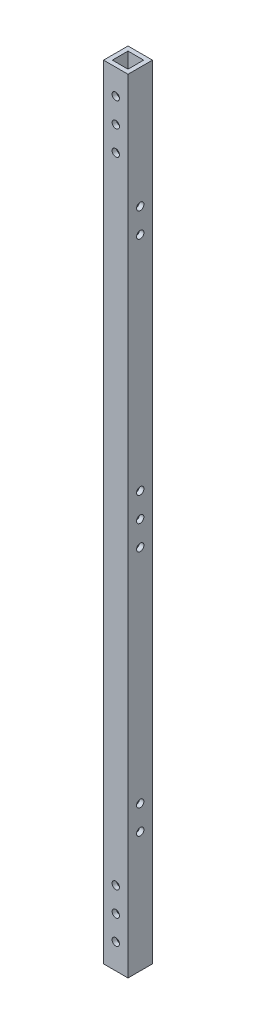
ISO-10303-21;
HEADER;
FILE_DESCRIPTION(('STEP AP214'),'2;1');
FILE_NAME('part.step','',(''),(''),'','','');
FILE_SCHEMA(('AUTOMOTIVE_DESIGN { 1 0 10303 214 1 1 1 1 }'));
ENDSEC;
DATA;
#1=APPLICATION_CONTEXT('core data for automotive mechanical design processes');
#2=APPLICATION_PROTOCOL_DEFINITION('international standard','automotive_design',2000,#1);
#3=PRODUCT_CONTEXT('',#1,'mechanical');
#4=PRODUCT('Part','Part','',(#3));
#5=PRODUCT_RELATED_PRODUCT_CATEGORY('part','',(#4));
#6=PRODUCT_DEFINITION_FORMATION('','',#4);
#7=PRODUCT_DEFINITION_CONTEXT('part definition',#1,'design');
#8=PRODUCT_DEFINITION('design','',#6,#7);
#9=PRODUCT_DEFINITION_SHAPE('','',#8);
#10=(LENGTH_UNIT() NAMED_UNIT(*) SI_UNIT(.MILLI.,.METRE.));
#11=(NAMED_UNIT(*) PLANE_ANGLE_UNIT() SI_UNIT($,.RADIAN.));
#12=(NAMED_UNIT(*) SI_UNIT($,.STERADIAN.) SOLID_ANGLE_UNIT());
#13=UNCERTAINTY_MEASURE_WITH_UNIT(LENGTH_MEASURE(1.E-05),#10,'distance_accuracy_value','');
#14=(GEOMETRIC_REPRESENTATION_CONTEXT(3) GLOBAL_UNCERTAINTY_ASSIGNED_CONTEXT((#13)) GLOBAL_UNIT_ASSIGNED_CONTEXT((#10,
#11,#12)) REPRESENTATION_CONTEXT('',''));
#15=CARTESIAN_POINT('',(0.,0.,0.));
#16=DIRECTION('',(0.,0.,1.));
#17=DIRECTION('',(1.,0.,0.));
#18=AXIS2_PLACEMENT_3D('',#15,#16,#17);
#19=CARTESIAN_POINT('',(0.,160.,0.));
#20=DIRECTION('',(0.,1.,0.));
#21=DIRECTION('',(0.,0.,1.));
#22=AXIS2_PLACEMENT_3D('',#19,#20,#21);
#23=PLANE('',#22);
#24=DIRECTION('',(0.,0.,-1.));
#25=VECTOR('',#24,1.);
#26=CARTESIAN_POINT('',(5.,160.,-5.));
#27=LINE('',#26,#25);
#28=CARTESIAN_POINT('',(5.,160.,5.));
#29=VERTEX_POINT('',#28);
#30=CARTESIAN_POINT('',(5.,160.,-5.));
#31=VERTEX_POINT('',#30);
#32=EDGE_CURVE('E156',#29,#31,#27,.T.);
#33=ORIENTED_EDGE('',*,*,#32,.T.);
#34=DIRECTION('',(-1.,0.,0.));
#35=VECTOR('',#34,1.);
#36=CARTESIAN_POINT('',(-5.,160.,-5.));
#37=LINE('',#36,#35);
#38=CARTESIAN_POINT('',(-5.,160.,-5.));
#39=VERTEX_POINT('',#38);
#40=EDGE_CURVE('E160',#31,#39,#37,.T.);
#41=ORIENTED_EDGE('',*,*,#40,.T.);
#42=DIRECTION('',(0.,0.,1.));
#43=VECTOR('',#42,1.);
#44=CARTESIAN_POINT('',(-5.,160.,-5.));
#45=LINE('',#44,#43);
#46=CARTESIAN_POINT('',(-5.,160.,5.));
#47=VERTEX_POINT('',#46);
#48=EDGE_CURVE('E164',#39,#47,#45,.T.);
#49=ORIENTED_EDGE('',*,*,#48,.T.);
#50=DIRECTION('',(1.,0.,0.));
#51=VECTOR('',#50,1.);
#52=CARTESIAN_POINT('',(-5.,160.,5.));
#53=LINE('',#52,#51);
#54=EDGE_CURVE('E167',#47,#29,#53,.T.);
#55=ORIENTED_EDGE('',*,*,#54,.T.);
#56=EDGE_LOOP('',(#33,#41,#49,#55));
#57=FACE_BOUND('',#56,.T.);
#58=DIRECTION('',(-1.,0.,0.));
#59=VECTOR('',#58,1.);
#60=CARTESIAN_POINT('',(-3.2,160.,-3.2));
#61=LINE('',#60,#59);
#62=CARTESIAN_POINT('',(3.2,160.,-3.2));
#63=VERTEX_POINT('',#62);
#64=CARTESIAN_POINT('',(-3.2,160.,-3.2));
#65=VERTEX_POINT('',#64);
#66=EDGE_CURVE('E115',#63,#65,#61,.T.);
#67=ORIENTED_EDGE('',*,*,#66,.F.);
#68=DIRECTION('',(0.,0.,-1.));
#69=VECTOR('',#68,1.);
#70=CARTESIAN_POINT('',(3.2,160.,-3.2));
#71=LINE('',#70,#69);
#72=CARTESIAN_POINT('',(3.2,160.,3.2));
#73=VERTEX_POINT('',#72);
#74=EDGE_CURVE('E106',#73,#63,#71,.T.);
#75=ORIENTED_EDGE('',*,*,#74,.F.);
#76=DIRECTION('',(1.,0.,0.));
#77=VECTOR('',#76,1.);
#78=CARTESIAN_POINT('',(-3.2,160.,3.2));
#79=LINE('',#78,#77);
#80=CARTESIAN_POINT('',(-3.2,160.,3.2));
#81=VERTEX_POINT('',#80);
#82=EDGE_CURVE('E132',#81,#73,#79,.T.);
#83=ORIENTED_EDGE('',*,*,#82,.F.);
#84=DIRECTION('',(0.,0.,1.));
#85=VECTOR('',#84,1.);
#86=CARTESIAN_POINT('',(-3.2,160.,-3.2));
#87=LINE('',#86,#85);
#88=EDGE_CURVE('E128',#65,#81,#87,.T.);
#89=ORIENTED_EDGE('',*,*,#88,.F.);
#90=EDGE_LOOP('',(#67,#75,#83,#89));
#91=FACE_BOUND('',#90,.T.);
#92=ADVANCED_FACE('F38',(#57,#91),#23,.T.);
#93=CARTESIAN_POINT('',(0.,-160.,0.));
#94=DIRECTION('',(0.,1.,0.));
#95=DIRECTION('',(0.,0.,1.));
#96=AXIS2_PLACEMENT_3D('',#93,#94,#95);
#97=PLANE('',#96);
#98=DIRECTION('',(0.,0.,-1.));
#99=VECTOR('',#98,1.);
#100=CARTESIAN_POINT('',(5.,-160.,-5.));
#101=LINE('',#100,#99);
#102=CARTESIAN_POINT('',(5.,-160.,5.));
#103=VERTEX_POINT('',#102);
#104=CARTESIAN_POINT('',(5.,-160.,-5.));
#105=VERTEX_POINT('',#104);
#106=EDGE_CURVE('E124',#103,#105,#101,.T.);
#107=ORIENTED_EDGE('',*,*,#106,.F.);
#108=DIRECTION('',(1.,0.,0.));
#109=VECTOR('',#108,1.);
#110=CARTESIAN_POINT('',(-5.,-160.,5.));
#111=LINE('',#110,#109);
#112=CARTESIAN_POINT('',(-5.,-160.,5.));
#113=VERTEX_POINT('',#112);
#114=EDGE_CURVE('E161',#113,#103,#111,.T.);
#115=ORIENTED_EDGE('',*,*,#114,.F.);
#116=DIRECTION('',(0.,0.,1.));
#117=VECTOR('',#116,1.);
#118=CARTESIAN_POINT('',(-5.,-160.,-5.));
#119=LINE('',#118,#117);
#120=CARTESIAN_POINT('',(-5.,-160.,-5.));
#121=VERTEX_POINT('',#120);
#122=EDGE_CURVE('E177',#121,#113,#119,.T.);
#123=ORIENTED_EDGE('',*,*,#122,.F.);
#124=DIRECTION('',(-1.,0.,0.));
#125=VECTOR('',#124,1.);
#126=CARTESIAN_POINT('',(-5.,-160.,-5.));
#127=LINE('',#126,#125);
#128=EDGE_CURVE('E174',#105,#121,#127,.T.);
#129=ORIENTED_EDGE('',*,*,#128,.F.);
#130=EDGE_LOOP('',(#107,#115,#123,#129));
#131=FACE_BOUND('',#130,.T.);
#132=DIRECTION('',(0.,0.,-1.));
#133=VECTOR('',#132,1.);
#134=CARTESIAN_POINT('',(3.2,-160.,-3.2));
#135=LINE('',#134,#133);
#136=CARTESIAN_POINT('',(3.2,-160.,3.2));
#137=VERTEX_POINT('',#136);
#138=CARTESIAN_POINT('',(3.2,-160.,-3.2));
#139=VERTEX_POINT('',#138);
#140=EDGE_CURVE('E64',#137,#139,#135,.T.);
#141=ORIENTED_EDGE('',*,*,#140,.T.);
#142=DIRECTION('',(-1.,0.,0.));
#143=VECTOR('',#142,1.);
#144=CARTESIAN_POINT('',(-3.2,-160.,-3.2));
#145=LINE('',#144,#143);
#146=CARTESIAN_POINT('',(-3.2,-160.,-3.2));
#147=VERTEX_POINT('',#146);
#148=EDGE_CURVE('E122',#139,#147,#145,.T.);
#149=ORIENTED_EDGE('',*,*,#148,.T.);
#150=DIRECTION('',(0.,0.,1.));
#151=VECTOR('',#150,1.);
#152=CARTESIAN_POINT('',(-3.2,-160.,-3.2));
#153=LINE('',#152,#151);
#154=CARTESIAN_POINT('',(-3.2,-160.,3.2));
#155=VERTEX_POINT('',#154);
#156=EDGE_CURVE('E143',#147,#155,#153,.T.);
#157=ORIENTED_EDGE('',*,*,#156,.T.);
#158=DIRECTION('',(1.,0.,0.));
#159=VECTOR('',#158,1.);
#160=CARTESIAN_POINT('',(-3.2,-160.,3.2));
#161=LINE('',#160,#159);
#162=EDGE_CURVE('E116',#155,#137,#161,.T.);
#163=ORIENTED_EDGE('',*,*,#162,.T.);
#164=EDGE_LOOP('',(#141,#149,#157,#163));
#165=FACE_BOUND('',#164,.T.);
#166=ADVANCED_FACE('F418',(#131,#165),#97,.F.);
#167=CARTESIAN_POINT('',(5.,160.,-5.));
#168=DIRECTION('',(-1.,0.,0.));
#169=DIRECTION('',(0.,0.,1.));
#170=AXIS2_PLACEMENT_3D('',#167,#168,#169);
#171=PLANE('',#170);
#172=CARTESIAN_POINT('',(5.,9.99999999999993,0.));
#173=DIRECTION('',(1.,0.,0.));
#174=DIRECTION('',(0.,0.,-1.));
#175=AXIS2_PLACEMENT_3D('',#172,#173,#174);
#176=CIRCLE('',#175,1.5);
#177=CARTESIAN_POINT('',(5.,9.99999999999993,-1.5));
#178=VERTEX_POINT('',#177);
#179=EDGE_CURVE('E502',#178,#178,#176,.T.);
#180=ORIENTED_EDGE('',*,*,#179,.F.);
#181=EDGE_LOOP('',(#180));
#182=FACE_BOUND('',#181,.T.);
#183=CARTESIAN_POINT('',(5.,-10.0000000000001,0.));
#184=DIRECTION('',(1.,0.,0.));
#185=DIRECTION('',(0.,0.,-1.));
#186=AXIS2_PLACEMENT_3D('',#183,#184,#185);
#187=CIRCLE('',#186,1.5);
#188=CARTESIAN_POINT('',(5.,-10.0000000000001,-1.5));
#189=VERTEX_POINT('',#188);
#190=EDGE_CURVE('E506',#189,#189,#187,.T.);
#191=ORIENTED_EDGE('',*,*,#190,.F.);
#192=EDGE_LOOP('',(#191));
#193=FACE_BOUND('',#192,.T.);
#194=CARTESIAN_POINT('',(5.,0.,0.));
#195=DIRECTION('',(1.,0.,0.));
#196=DIRECTION('',(0.,0.,-1.));
#197=AXIS2_PLACEMENT_3D('',#194,#195,#196);
#198=CIRCLE('',#197,1.5);
#199=CARTESIAN_POINT('',(5.,0.,-1.5));
#200=VERTEX_POINT('',#199);
#201=EDGE_CURVE('E263',#200,#200,#198,.T.);
#202=ORIENTED_EDGE('',*,*,#201,.F.);
#203=EDGE_LOOP('',(#202));
#204=FACE_BOUND('',#203,.T.);
#205=CARTESIAN_POINT('',(5.,-110.7,0.));
#206=DIRECTION('',(-1.,0.,0.));
#207=DIRECTION('',(0.,0.,1.));
#208=AXIS2_PLACEMENT_3D('',#205,#206,#207);
#209=CIRCLE('',#208,1.5);
#210=CARTESIAN_POINT('',(5.,-110.7,1.50000000000005));
#211=VERTEX_POINT('',#210);
#212=EDGE_CURVE('E227',#211,#211,#209,.T.);
#213=ORIENTED_EDGE('',*,*,#212,.T.);
#214=EDGE_LOOP('',(#213));
#215=FACE_BOUND('',#214,.T.);
#216=CARTESIAN_POINT('',(5.,-100.7,0.));
#217=DIRECTION('',(-1.,0.,0.));
#218=DIRECTION('',(0.,0.,1.));
#219=AXIS2_PLACEMENT_3D('',#216,#217,#218);
#220=CIRCLE('',#219,1.5);
#221=CARTESIAN_POINT('',(5.,-100.7,1.50000000000005));
#222=VERTEX_POINT('',#221);
#223=EDGE_CURVE('E278',#222,#222,#220,.T.);
#224=ORIENTED_EDGE('',*,*,#223,.T.);
#225=EDGE_LOOP('',(#224));
#226=FACE_BOUND('',#225,.T.);
#227=CARTESIAN_POINT('',(5.,100.7,0.));
#228=DIRECTION('',(-1.,0.,0.));
#229=DIRECTION('',(0.,0.,-1.));
#230=AXIS2_PLACEMENT_3D('',#227,#228,#229);
#231=CIRCLE('',#230,1.5);
#232=CARTESIAN_POINT('',(5.,100.7,-1.49999999999998));
#233=VERTEX_POINT('',#232);
#234=EDGE_CURVE('E286',#233,#233,#231,.T.);
#235=ORIENTED_EDGE('',*,*,#234,.T.);
#236=EDGE_LOOP('',(#235));
#237=FACE_BOUND('',#236,.T.);
#238=CARTESIAN_POINT('',(5.,110.7,0.));
#239=DIRECTION('',(-1.,0.,0.));
#240=DIRECTION('',(0.,0.,-1.));
#241=AXIS2_PLACEMENT_3D('',#238,#239,#240);
#242=CIRCLE('',#241,1.5);
#243=CARTESIAN_POINT('',(5.,110.7,-1.49999999999998));
#244=VERTEX_POINT('',#243);
#245=EDGE_CURVE('E294',#244,#244,#242,.T.);
#246=ORIENTED_EDGE('',*,*,#245,.T.);
#247=EDGE_LOOP('',(#246));
#248=FACE_BOUND('',#247,.T.);
#249=ORIENTED_EDGE('',*,*,#106,.T.);
#250=DIRECTION('',(0.,-1.,0.));
#251=VECTOR('',#250,1.);
#252=CARTESIAN_POINT('',(5.,160.,-5.));
#253=LINE('',#252,#251);
#254=EDGE_CURVE('E11',#31,#105,#253,.T.);
#255=ORIENTED_EDGE('',*,*,#254,.F.);
#256=ORIENTED_EDGE('',*,*,#32,.F.);
#257=DIRECTION('',(0.,-1.,0.));
#258=VECTOR('',#257,1.);
#259=CARTESIAN_POINT('',(5.,160.,5.));
#260=LINE('',#259,#258);
#261=EDGE_CURVE('E170',#29,#103,#260,.T.);
#262=ORIENTED_EDGE('',*,*,#261,.T.);
#263=EDGE_LOOP('',(#249,#255,#256,#262));
#264=FACE_BOUND('',#263,.T.);
#265=ADVANCED_FACE('F40',(#182,#193,#204,#215,#226,#237,#248,#264),#171,.F.);
#266=CARTESIAN_POINT('',(-5.,160.,-5.));
#267=DIRECTION('',(0.,0.,1.));
#268=DIRECTION('',(1.,0.,0.));
#269=AXIS2_PLACEMENT_3D('',#266,#267,#268);
#270=PLANE('',#269);
#271=CARTESIAN_POINT('',(0.,-149.7,-5.));
#272=DIRECTION('',(0.,0.,-1.));
#273=DIRECTION('',(-1.,0.,0.));
#274=AXIS2_PLACEMENT_3D('',#271,#272,#273);
#275=CIRCLE('',#274,1.5);
#276=CARTESIAN_POINT('',(-1.50000000000002,-149.7,-5.));
#277=VERTEX_POINT('',#276);
#278=EDGE_CURVE('E317',#277,#277,#275,.T.);
#279=ORIENTED_EDGE('',*,*,#278,.F.);
#280=EDGE_LOOP('',(#279));
#281=FACE_BOUND('',#280,.T.);
#282=CARTESIAN_POINT('',(0.,129.7,-5.));
#283=DIRECTION('',(0.,0.,-1.));
#284=DIRECTION('',(1.,0.,0.));
#285=AXIS2_PLACEMENT_3D('',#282,#283,#284);
#286=CIRCLE('',#285,1.5);
#287=CARTESIAN_POINT('',(1.50000000000002,129.7,-5.));
#288=VERTEX_POINT('',#287);
#289=EDGE_CURVE('E313',#288,#288,#286,.T.);
#290=ORIENTED_EDGE('',*,*,#289,.F.);
#291=EDGE_LOOP('',(#290));
#292=FACE_BOUND('',#291,.T.);
#293=CARTESIAN_POINT('',(0.,149.7,-5.));
#294=DIRECTION('',(0.,0.,-1.));
#295=DIRECTION('',(1.,0.,0.));
#296=AXIS2_PLACEMENT_3D('',#293,#294,#295);
#297=CIRCLE('',#296,1.5);
#298=CARTESIAN_POINT('',(1.50000000000002,149.7,-5.));
#299=VERTEX_POINT('',#298);
#300=EDGE_CURVE('E326',#299,#299,#297,.T.);
#301=ORIENTED_EDGE('',*,*,#300,.F.);
#302=EDGE_LOOP('',(#301));
#303=FACE_BOUND('',#302,.T.);
#304=CARTESIAN_POINT('',(0.,139.7,-5.));
#305=DIRECTION('',(0.,0.,-1.));
#306=DIRECTION('',(1.,0.,0.));
#307=AXIS2_PLACEMENT_3D('',#304,#305,#306);
#308=CIRCLE('',#307,1.5);
#309=CARTESIAN_POINT('',(1.50000000000002,139.7,-5.));
#310=VERTEX_POINT('',#309);
#311=EDGE_CURVE('E349',#310,#310,#308,.T.);
#312=ORIENTED_EDGE('',*,*,#311,.F.);
#313=EDGE_LOOP('',(#312));
#314=FACE_BOUND('',#313,.T.);
#315=CARTESIAN_POINT('',(0.,-129.7,-5.));
#316=DIRECTION('',(0.,0.,-1.));
#317=DIRECTION('',(-1.,0.,0.));
#318=AXIS2_PLACEMENT_3D('',#315,#316,#317);
#319=CIRCLE('',#318,1.5);
#320=CARTESIAN_POINT('',(-1.50000000000002,-129.7,-5.));
#321=VERTEX_POINT('',#320);
#322=EDGE_CURVE('E341',#321,#321,#319,.T.);
#323=ORIENTED_EDGE('',*,*,#322,.F.);
#324=EDGE_LOOP('',(#323));
#325=FACE_BOUND('',#324,.T.);
#326=CARTESIAN_POINT('',(0.,-139.7,-5.));
#327=DIRECTION('',(0.,0.,-1.));
#328=DIRECTION('',(-1.,0.,0.));
#329=AXIS2_PLACEMENT_3D('',#326,#327,#328);
#330=CIRCLE('',#329,1.5);
#331=CARTESIAN_POINT('',(-1.50000000000002,-139.7,-5.));
#332=VERTEX_POINT('',#331);
#333=EDGE_CURVE('E333',#332,#332,#330,.T.);
#334=ORIENTED_EDGE('',*,*,#333,.F.);
#335=EDGE_LOOP('',(#334));
#336=FACE_BOUND('',#335,.T.);
#337=ORIENTED_EDGE('',*,*,#128,.T.);
#338=DIRECTION('',(0.,-1.,0.));
#339=VECTOR('',#338,1.);
#340=CARTESIAN_POINT('',(-5.,160.,-5.));
#341=LINE('',#340,#339);
#342=EDGE_CURVE('E48',#39,#121,#341,.T.);
#343=ORIENTED_EDGE('',*,*,#342,.F.);
#344=ORIENTED_EDGE('',*,*,#40,.F.);
#345=ORIENTED_EDGE('',*,*,#254,.T.);
#346=EDGE_LOOP('',(#337,#343,#344,#345));
#347=FACE_BOUND('',#346,.T.);
#348=ADVANCED_FACE('F404',(#281,#292,#303,#314,#325,#336,#347),#270,.F.);
#349=CARTESIAN_POINT('',(-5.,160.,-5.));
#350=DIRECTION('',(1.,0.,0.));
#351=DIRECTION('',(0.,0.,-1.));
#352=AXIS2_PLACEMENT_3D('',#349,#350,#351);
#353=PLANE('',#352);
#354=CARTESIAN_POINT('',(-5.,9.99999999999993,0.));
#355=DIRECTION('',(1.,0.,0.));
#356=DIRECTION('',(0.,0.,-1.));
#357=AXIS2_PLACEMENT_3D('',#354,#355,#356);
#358=CIRCLE('',#357,1.5);
#359=CARTESIAN_POINT('',(-5.,9.99999999999993,-1.5));
#360=VERTEX_POINT('',#359);
#361=EDGE_CURVE('E447',#360,#360,#358,.T.);
#362=ORIENTED_EDGE('',*,*,#361,.T.);
#363=EDGE_LOOP('',(#362));
#364=FACE_BOUND('',#363,.T.);
#365=CARTESIAN_POINT('',(-5.,-10.0000000000001,0.));
#366=DIRECTION('',(1.,0.,0.));
#367=DIRECTION('',(0.,0.,-1.));
#368=AXIS2_PLACEMENT_3D('',#365,#366,#367);
#369=CIRCLE('',#368,1.5);
#370=CARTESIAN_POINT('',(-5.,-10.0000000000001,-1.5));
#371=VERTEX_POINT('',#370);
#372=EDGE_CURVE('E451',#371,#371,#369,.T.);
#373=ORIENTED_EDGE('',*,*,#372,.T.);
#374=EDGE_LOOP('',(#373));
#375=FACE_BOUND('',#374,.T.);
#376=CARTESIAN_POINT('',(-5.,0.,0.));
#377=DIRECTION('',(1.,0.,0.));
#378=DIRECTION('',(0.,0.,-1.));
#379=AXIS2_PLACEMENT_3D('',#376,#377,#378);
#380=CIRCLE('',#379,1.5);
#381=CARTESIAN_POINT('',(-5.,0.,-1.5));
#382=VERTEX_POINT('',#381);
#383=EDGE_CURVE('E247',#382,#382,#380,.T.);
#384=ORIENTED_EDGE('',*,*,#383,.T.);
#385=EDGE_LOOP('',(#384));
#386=FACE_BOUND('',#385,.T.);
#387=CARTESIAN_POINT('',(-5.,-110.7,0.));
#388=DIRECTION('',(-1.,0.,0.));
#389=DIRECTION('',(0.,0.,1.));
#390=AXIS2_PLACEMENT_3D('',#387,#388,#389);
#391=CIRCLE('',#390,1.5);
#392=CARTESIAN_POINT('',(-5.,-110.7,1.50000000000005));
#393=VERTEX_POINT('',#392);
#394=EDGE_CURVE('E274',#393,#393,#391,.T.);
#395=ORIENTED_EDGE('',*,*,#394,.F.);
#396=EDGE_LOOP('',(#395));
#397=FACE_BOUND('',#396,.T.);
#398=CARTESIAN_POINT('',(-5.,-100.7,0.));
#399=DIRECTION('',(-1.,0.,0.));
#400=DIRECTION('',(0.,0.,1.));
#401=AXIS2_PLACEMENT_3D('',#398,#399,#400);
#402=CIRCLE('',#401,1.5);
#403=CARTESIAN_POINT('',(-5.,-100.7,1.50000000000005));
#404=VERTEX_POINT('',#403);
#405=EDGE_CURVE('E282',#404,#404,#402,.T.);
#406=ORIENTED_EDGE('',*,*,#405,.F.);
#407=EDGE_LOOP('',(#406));
#408=FACE_BOUND('',#407,.T.);
#409=CARTESIAN_POINT('',(-5.,100.7,0.));
#410=DIRECTION('',(-1.,0.,0.));
#411=DIRECTION('',(0.,0.,-1.));
#412=AXIS2_PLACEMENT_3D('',#409,#410,#411);
#413=CIRCLE('',#412,1.5);
#414=CARTESIAN_POINT('',(-5.,100.7,-1.49999999999998));
#415=VERTEX_POINT('',#414);
#416=EDGE_CURVE('E290',#415,#415,#413,.T.);
#417=ORIENTED_EDGE('',*,*,#416,.F.);
#418=EDGE_LOOP('',(#417));
#419=FACE_BOUND('',#418,.T.);
#420=CARTESIAN_POINT('',(-5.,110.7,0.));
#421=DIRECTION('',(-1.,0.,0.));
#422=DIRECTION('',(0.,0.,-1.));
#423=AXIS2_PLACEMENT_3D('',#420,#421,#422);
#424=CIRCLE('',#423,1.5);
#425=CARTESIAN_POINT('',(-5.,110.7,-1.49999999999998));
#426=VERTEX_POINT('',#425);
#427=EDGE_CURVE('E270',#426,#426,#424,.T.);
#428=ORIENTED_EDGE('',*,*,#427,.F.);
#429=EDGE_LOOP('',(#428));
#430=FACE_BOUND('',#429,.T.);
#431=ORIENTED_EDGE('',*,*,#122,.T.);
#432=DIRECTION('',(0.,-1.,0.));
#433=VECTOR('',#432,1.);
#434=CARTESIAN_POINT('',(-5.,160.,5.));
#435=LINE('',#434,#433);
#436=EDGE_CURVE('E185',#47,#113,#435,.T.);
#437=ORIENTED_EDGE('',*,*,#436,.F.);
#438=ORIENTED_EDGE('',*,*,#48,.F.);
#439=ORIENTED_EDGE('',*,*,#342,.T.);
#440=EDGE_LOOP('',(#431,#437,#438,#439));
#441=FACE_BOUND('',#440,.T.);
#442=ADVANCED_FACE('F407',(#364,#375,#386,#397,#408,#419,#430,#441),#353,.F.);
#443=CARTESIAN_POINT('',(-5.,160.,5.));
#444=DIRECTION('',(0.,0.,-1.));
#445=DIRECTION('',(-1.,0.,0.));
#446=AXIS2_PLACEMENT_3D('',#443,#444,#445);
#447=PLANE('',#446);
#448=CARTESIAN_POINT('',(0.,-149.7,5.));
#449=DIRECTION('',(0.,0.,-1.));
#450=DIRECTION('',(-1.,0.,0.));
#451=AXIS2_PLACEMENT_3D('',#448,#449,#450);
#452=CIRCLE('',#451,1.5);
#453=CARTESIAN_POINT('',(-1.50000000000002,-149.7,5.));
#454=VERTEX_POINT('',#453);
#455=EDGE_CURVE('E197',#454,#454,#452,.T.);
#456=ORIENTED_EDGE('',*,*,#455,.T.);
#457=EDGE_LOOP('',(#456));
#458=FACE_BOUND('',#457,.T.);
#459=CARTESIAN_POINT('',(0.,129.7,5.));
#460=DIRECTION('',(0.,0.,-1.));
#461=DIRECTION('',(1.,0.,0.));
#462=AXIS2_PLACEMENT_3D('',#459,#460,#461);
#463=CIRCLE('',#462,1.5);
#464=CARTESIAN_POINT('',(1.50000000000002,129.7,5.));
#465=VERTEX_POINT('',#464);
#466=EDGE_CURVE('E322',#465,#465,#463,.T.);
#467=ORIENTED_EDGE('',*,*,#466,.T.);
#468=EDGE_LOOP('',(#467));
#469=FACE_BOUND('',#468,.T.);
#470=CARTESIAN_POINT('',(0.,149.7,5.));
#471=DIRECTION('',(0.,0.,-1.));
#472=DIRECTION('',(1.,0.,0.));
#473=AXIS2_PLACEMENT_3D('',#470,#471,#472);
#474=CIRCLE('',#473,1.5);
#475=CARTESIAN_POINT('',(1.50000000000002,149.7,5.));
#476=VERTEX_POINT('',#475);
#477=EDGE_CURVE('E353',#476,#476,#474,.T.);
#478=ORIENTED_EDGE('',*,*,#477,.T.);
#479=EDGE_LOOP('',(#478));
#480=FACE_BOUND('',#479,.T.);
#481=CARTESIAN_POINT('',(0.,139.7,5.));
#482=DIRECTION('',(0.,0.,-1.));
#483=DIRECTION('',(1.,0.,0.));
#484=AXIS2_PLACEMENT_3D('',#481,#482,#483);
#485=CIRCLE('',#484,1.5);
#486=CARTESIAN_POINT('',(1.50000000000002,139.7,5.));
#487=VERTEX_POINT('',#486);
#488=EDGE_CURVE('E345',#487,#487,#485,.T.);
#489=ORIENTED_EDGE('',*,*,#488,.T.);
#490=EDGE_LOOP('',(#489));
#491=FACE_BOUND('',#490,.T.);
#492=CARTESIAN_POINT('',(0.,-129.7,5.));
#493=DIRECTION('',(0.,0.,-1.));
#494=DIRECTION('',(-1.,0.,0.));
#495=AXIS2_PLACEMENT_3D('',#492,#493,#494);
#496=CIRCLE('',#495,1.5);
#497=CARTESIAN_POINT('',(-1.50000000000002,-129.7,5.));
#498=VERTEX_POINT('',#497);
#499=EDGE_CURVE('E337',#498,#498,#496,.T.);
#500=ORIENTED_EDGE('',*,*,#499,.T.);
#501=EDGE_LOOP('',(#500));
#502=FACE_BOUND('',#501,.T.);
#503=CARTESIAN_POINT('',(0.,-139.7,5.));
#504=DIRECTION('',(0.,0.,-1.));
#505=DIRECTION('',(-1.,0.,0.));
#506=AXIS2_PLACEMENT_3D('',#503,#504,#505);
#507=CIRCLE('',#506,1.5);
#508=CARTESIAN_POINT('',(-1.50000000000002,-139.7,5.));
#509=VERTEX_POINT('',#508);
#510=EDGE_CURVE('E321',#509,#509,#507,.T.);
#511=ORIENTED_EDGE('',*,*,#510,.T.);
#512=EDGE_LOOP('',(#511));
#513=FACE_BOUND('',#512,.T.);
#514=ORIENTED_EDGE('',*,*,#114,.T.);
#515=ORIENTED_EDGE('',*,*,#261,.F.);
#516=ORIENTED_EDGE('',*,*,#54,.F.);
#517=ORIENTED_EDGE('',*,*,#436,.T.);
#518=EDGE_LOOP('',(#514,#515,#516,#517));
#519=FACE_BOUND('',#518,.T.);
#520=ADVANCED_FACE('F422',(#458,#469,#480,#491,#502,#513,#519),#447,.F.);
#521=CARTESIAN_POINT('',(3.2,160.,-3.2));
#522=DIRECTION('',(-1.,0.,0.));
#523=DIRECTION('',(0.,0.,1.));
#524=AXIS2_PLACEMENT_3D('',#521,#522,#523);
#525=PLANE('',#524);
#526=CARTESIAN_POINT('',(3.2,9.99999999999993,0.));
#527=DIRECTION('',(-1.,0.,0.));
#528=DIRECTION('',(0.,0.,1.));
#529=AXIS2_PLACEMENT_3D('',#526,#527,#528);
#530=CIRCLE('',#529,1.5);
#531=CARTESIAN_POINT('',(3.2,9.99999999999993,1.5));
#532=VERTEX_POINT('',#531);
#533=EDGE_CURVE('E266',#532,#532,#530,.T.);
#534=ORIENTED_EDGE('',*,*,#533,.F.);
#535=EDGE_LOOP('',(#534));
#536=FACE_BOUND('',#535,.T.);
#537=CARTESIAN_POINT('',(3.2,-10.0000000000001,0.));
#538=DIRECTION('',(-1.,0.,0.));
#539=DIRECTION('',(0.,0.,1.));
#540=AXIS2_PLACEMENT_3D('',#537,#538,#539);
#541=CIRCLE('',#540,1.5);
#542=CARTESIAN_POINT('',(3.2,-10.0000000000001,1.5));
#543=VERTEX_POINT('',#542);
#544=EDGE_CURVE('E251',#543,#543,#541,.T.);
#545=ORIENTED_EDGE('',*,*,#544,.F.);
#546=EDGE_LOOP('',(#545));
#547=FACE_BOUND('',#546,.T.);
#548=CARTESIAN_POINT('',(3.2,0.,0.));
#549=DIRECTION('',(-1.,0.,0.));
#550=DIRECTION('',(0.,0.,1.));
#551=AXIS2_PLACEMENT_3D('',#548,#549,#550);
#552=CIRCLE('',#551,1.5);
#553=CARTESIAN_POINT('',(3.2,0.,1.5));
#554=VERTEX_POINT('',#553);
#555=EDGE_CURVE('E246',#554,#554,#552,.T.);
#556=ORIENTED_EDGE('',*,*,#555,.F.);
#557=EDGE_LOOP('',(#556));
#558=FACE_BOUND('',#557,.T.);
#559=CARTESIAN_POINT('',(3.2,-110.7,0.));
#560=DIRECTION('',(-1.,0.,0.));
#561=DIRECTION('',(0.,0.,1.));
#562=AXIS2_PLACEMENT_3D('',#559,#560,#561);
#563=CIRCLE('',#562,1.5);
#564=CARTESIAN_POINT('',(3.2,-110.7,1.50000000000005));
#565=VERTEX_POINT('',#564);
#566=EDGE_CURVE('E242',#565,#565,#563,.T.);
#567=ORIENTED_EDGE('',*,*,#566,.F.);
#568=EDGE_LOOP('',(#567));
#569=FACE_BOUND('',#568,.T.);
#570=CARTESIAN_POINT('',(3.2,-100.7,0.));
#571=DIRECTION('',(-1.,0.,0.));
#572=DIRECTION('',(0.,0.,1.));
#573=AXIS2_PLACEMENT_3D('',#570,#571,#572);
#574=CIRCLE('',#573,1.5);
#575=CARTESIAN_POINT('',(3.2,-100.7,1.50000000000005));
#576=VERTEX_POINT('',#575);
#577=EDGE_CURVE('E237',#576,#576,#574,.T.);
#578=ORIENTED_EDGE('',*,*,#577,.F.);
#579=EDGE_LOOP('',(#578));
#580=FACE_BOUND('',#579,.T.);
#581=CARTESIAN_POINT('',(3.2,100.7,0.));
#582=DIRECTION('',(-1.,0.,0.));
#583=DIRECTION('',(0.,0.,1.));
#584=AXIS2_PLACEMENT_3D('',#581,#582,#583);
#585=CIRCLE('',#584,1.5);
#586=CARTESIAN_POINT('',(3.2,100.7,1.50000000000003));
#587=VERTEX_POINT('',#586);
#588=EDGE_CURVE('E232',#587,#587,#585,.T.);
#589=ORIENTED_EDGE('',*,*,#588,.F.);
#590=EDGE_LOOP('',(#589));
#591=FACE_BOUND('',#590,.T.);
#592=CARTESIAN_POINT('',(3.2,110.7,0.));
#593=DIRECTION('',(-1.,0.,0.));
#594=DIRECTION('',(0.,0.,1.));
#595=AXIS2_PLACEMENT_3D('',#592,#593,#594);
#596=CIRCLE('',#595,1.5);
#597=CARTESIAN_POINT('',(3.2,110.7,1.50000000000002));
#598=VERTEX_POINT('',#597);
#599=EDGE_CURVE('E226',#598,#598,#596,.T.);
#600=ORIENTED_EDGE('',*,*,#599,.F.);
#601=EDGE_LOOP('',(#600));
#602=FACE_BOUND('',#601,.T.);
#603=ORIENTED_EDGE('',*,*,#140,.F.);
#604=DIRECTION('',(0.,-1.,0.));
#605=VECTOR('',#604,1.);
#606=CARTESIAN_POINT('',(3.2,160.,3.2));
#607=LINE('',#606,#605);
#608=EDGE_CURVE('E110',#73,#137,#607,.T.);
#609=ORIENTED_EDGE('',*,*,#608,.F.);
#610=ORIENTED_EDGE('',*,*,#74,.T.);
#611=DIRECTION('',(0.,-1.,0.));
#612=VECTOR('',#611,1.);
#613=CARTESIAN_POINT('',(3.2,160.,-3.2));
#614=LINE('',#613,#612);
#615=EDGE_CURVE('E109',#63,#139,#614,.T.);
#616=ORIENTED_EDGE('',*,*,#615,.T.);
#617=EDGE_LOOP('',(#603,#609,#610,#616));
#618=FACE_BOUND('',#617,.T.);
#619=ADVANCED_FACE('F108',(#536,#547,#558,#569,#580,#591,#602,#618),#525,.T.);
#620=CARTESIAN_POINT('',(-3.2,160.,-3.2));
#621=DIRECTION('',(0.,0.,1.));
#622=DIRECTION('',(1.,0.,0.));
#623=AXIS2_PLACEMENT_3D('',#620,#621,#622);
#624=PLANE('',#623);
#625=CARTESIAN_POINT('',(0.,-149.7,-3.2));
#626=DIRECTION('',(0.,0.,1.));
#627=DIRECTION('',(1.,0.,0.));
#628=AXIS2_PLACEMENT_3D('',#625,#626,#627);
#629=CIRCLE('',#628,1.5);
#630=CARTESIAN_POINT('',(1.49999999999998,-149.7,-3.2));
#631=VERTEX_POINT('',#630);
#632=EDGE_CURVE('E140',#631,#631,#629,.T.);
#633=ORIENTED_EDGE('',*,*,#632,.F.);
#634=EDGE_LOOP('',(#633));
#635=FACE_BOUND('',#634,.T.);
#636=CARTESIAN_POINT('',(0.,129.7,-3.2));
#637=DIRECTION('',(0.,0.,1.));
#638=DIRECTION('',(1.,0.,0.));
#639=AXIS2_PLACEMENT_3D('',#636,#637,#638);
#640=CIRCLE('',#639,1.5);
#641=CARTESIAN_POINT('',(1.50000000000002,129.7,-3.2));
#642=VERTEX_POINT('',#641);
#643=EDGE_CURVE('E217',#642,#642,#640,.T.);
#644=ORIENTED_EDGE('',*,*,#643,.F.);
#645=EDGE_LOOP('',(#644));
#646=FACE_BOUND('',#645,.T.);
#647=CARTESIAN_POINT('',(0.,149.7,-3.2));
#648=DIRECTION('',(0.,0.,1.));
#649=DIRECTION('',(1.,0.,0.));
#650=AXIS2_PLACEMENT_3D('',#647,#648,#649);
#651=CIRCLE('',#650,1.5);
#652=CARTESIAN_POINT('',(1.50000000000002,149.7,-3.2));
#653=VERTEX_POINT('',#652);
#654=EDGE_CURVE('E212',#653,#653,#651,.T.);
#655=ORIENTED_EDGE('',*,*,#654,.F.);
#656=EDGE_LOOP('',(#655));
#657=FACE_BOUND('',#656,.T.);
#658=CARTESIAN_POINT('',(0.,139.7,-3.2));
#659=DIRECTION('',(0.,0.,1.));
#660=DIRECTION('',(1.,0.,0.));
#661=AXIS2_PLACEMENT_3D('',#658,#659,#660);
#662=CIRCLE('',#661,1.5);
#663=CARTESIAN_POINT('',(1.50000000000002,139.7,-3.2));
#664=VERTEX_POINT('',#663);
#665=EDGE_CURVE('E207',#664,#664,#662,.T.);
#666=ORIENTED_EDGE('',*,*,#665,.F.);
#667=EDGE_LOOP('',(#666));
#668=FACE_BOUND('',#667,.T.);
#669=CARTESIAN_POINT('',(0.,-129.7,-3.2));
#670=DIRECTION('',(0.,0.,1.));
#671=DIRECTION('',(1.,0.,0.));
#672=AXIS2_PLACEMENT_3D('',#669,#670,#671);
#673=CIRCLE('',#672,1.5);
#674=CARTESIAN_POINT('',(1.49999999999998,-129.7,-3.2));
#675=VERTEX_POINT('',#674);
#676=EDGE_CURVE('E202',#675,#675,#673,.T.);
#677=ORIENTED_EDGE('',*,*,#676,.F.);
#678=EDGE_LOOP('',(#677));
#679=FACE_BOUND('',#678,.T.);
#680=CARTESIAN_POINT('',(0.,-139.7,-3.2));
#681=DIRECTION('',(0.,0.,1.));
#682=DIRECTION('',(1.,0.,0.));
#683=AXIS2_PLACEMENT_3D('',#680,#681,#682);
#684=CIRCLE('',#683,1.5);
#685=CARTESIAN_POINT('',(1.49999999999998,-139.7,-3.2));
#686=VERTEX_POINT('',#685);
#687=EDGE_CURVE('E196',#686,#686,#684,.T.);
#688=ORIENTED_EDGE('',*,*,#687,.F.);
#689=EDGE_LOOP('',(#688));
#690=FACE_BOUND('',#689,.T.);
#691=ORIENTED_EDGE('',*,*,#148,.F.);
#692=ORIENTED_EDGE('',*,*,#615,.F.);
#693=ORIENTED_EDGE('',*,*,#66,.T.);
#694=DIRECTION('',(0.,-1.,0.));
#695=VECTOR('',#694,1.);
#696=CARTESIAN_POINT('',(-3.2,160.,-3.2));
#697=LINE('',#696,#695);
#698=EDGE_CURVE('E125',#65,#147,#697,.T.);
#699=ORIENTED_EDGE('',*,*,#698,.T.);
#700=EDGE_LOOP('',(#691,#692,#693,#699));
#701=FACE_BOUND('',#700,.T.);
#702=ADVANCED_FACE('F119',(#635,#646,#657,#668,#679,#690,#701),#624,.T.);
#703=CARTESIAN_POINT('',(-3.2,160.,-3.2));
#704=DIRECTION('',(1.,0.,0.));
#705=DIRECTION('',(0.,0.,-1.));
#706=AXIS2_PLACEMENT_3D('',#703,#704,#705);
#707=PLANE('',#706);
#708=CARTESIAN_POINT('',(-3.2,9.99999999999993,0.));
#709=DIRECTION('',(1.,0.,0.));
#710=DIRECTION('',(0.,0.,-1.));
#711=AXIS2_PLACEMENT_3D('',#708,#709,#710);
#712=CIRCLE('',#711,1.5);
#713=CARTESIAN_POINT('',(-3.2,9.99999999999993,-1.5));
#714=VERTEX_POINT('',#713);
#715=EDGE_CURVE('E42',#714,#714,#712,.T.);
#716=ORIENTED_EDGE('',*,*,#715,.F.);
#717=EDGE_LOOP('',(#716));
#718=FACE_BOUND('',#717,.T.);
#719=CARTESIAN_POINT('',(-3.2,-10.0000000000001,0.));
#720=DIRECTION('',(1.,0.,0.));
#721=DIRECTION('',(0.,0.,-1.));
#722=AXIS2_PLACEMENT_3D('',#719,#720,#721);
#723=CIRCLE('',#722,1.5);
#724=CARTESIAN_POINT('',(-3.2,-10.0000000000001,-1.5));
#725=VERTEX_POINT('',#724);
#726=EDGE_CURVE('E248',#725,#725,#723,.T.);
#727=ORIENTED_EDGE('',*,*,#726,.F.);
#728=EDGE_LOOP('',(#727));
#729=FACE_BOUND('',#728,.T.);
#730=CARTESIAN_POINT('',(-3.2,0.,0.));
#731=DIRECTION('',(1.,0.,0.));
#732=DIRECTION('',(0.,0.,-1.));
#733=AXIS2_PLACEMENT_3D('',#730,#731,#732);
#734=CIRCLE('',#733,1.5);
#735=CARTESIAN_POINT('',(-3.2,0.,-1.5));
#736=VERTEX_POINT('',#735);
#737=EDGE_CURVE('E243',#736,#736,#734,.T.);
#738=ORIENTED_EDGE('',*,*,#737,.F.);
#739=EDGE_LOOP('',(#738));
#740=FACE_BOUND('',#739,.T.);
#741=CARTESIAN_POINT('',(-3.2,-110.7,0.));
#742=DIRECTION('',(1.,0.,0.));
#743=DIRECTION('',(0.,0.,-1.));
#744=AXIS2_PLACEMENT_3D('',#741,#742,#743);
#745=CIRCLE('',#744,1.5);
#746=CARTESIAN_POINT('',(-3.2,-110.7,-1.49999999999996));
#747=VERTEX_POINT('',#746);
#748=EDGE_CURVE('E238',#747,#747,#745,.T.);
#749=ORIENTED_EDGE('',*,*,#748,.F.);
#750=EDGE_LOOP('',(#749));
#751=FACE_BOUND('',#750,.T.);
#752=CARTESIAN_POINT('',(-3.2,-100.7,0.));
#753=DIRECTION('',(1.,0.,0.));
#754=DIRECTION('',(0.,0.,-1.));
#755=AXIS2_PLACEMENT_3D('',#752,#753,#754);
#756=CIRCLE('',#755,1.5);
#757=CARTESIAN_POINT('',(-3.2,-100.7,-1.49999999999995));
#758=VERTEX_POINT('',#757);
#759=EDGE_CURVE('E233',#758,#758,#756,.T.);
#760=ORIENTED_EDGE('',*,*,#759,.F.);
#761=EDGE_LOOP('',(#760));
#762=FACE_BOUND('',#761,.T.);
#763=CARTESIAN_POINT('',(-3.2,100.7,0.));
#764=DIRECTION('',(1.,0.,0.));
#765=DIRECTION('',(0.,0.,-1.));
#766=AXIS2_PLACEMENT_3D('',#763,#764,#765);
#767=CIRCLE('',#766,1.5);
#768=CARTESIAN_POINT('',(-3.2,100.7,-1.49999999999998));
#769=VERTEX_POINT('',#768);
#770=EDGE_CURVE('E228',#769,#769,#767,.T.);
#771=ORIENTED_EDGE('',*,*,#770,.F.);
#772=EDGE_LOOP('',(#771));
#773=FACE_BOUND('',#772,.T.);
#774=CARTESIAN_POINT('',(-3.2,110.7,0.));
#775=DIRECTION('',(1.,0.,0.));
#776=DIRECTION('',(0.,0.,-1.));
#777=AXIS2_PLACEMENT_3D('',#774,#775,#776);
#778=CIRCLE('',#777,1.5);
#779=CARTESIAN_POINT('',(-3.2,110.7,-1.49999999999998));
#780=VERTEX_POINT('',#779);
#781=EDGE_CURVE('E222',#780,#780,#778,.T.);
#782=ORIENTED_EDGE('',*,*,#781,.F.);
#783=EDGE_LOOP('',(#782));
#784=FACE_BOUND('',#783,.T.);
#785=ORIENTED_EDGE('',*,*,#156,.F.);
#786=ORIENTED_EDGE('',*,*,#698,.F.);
#787=ORIENTED_EDGE('',*,*,#88,.T.);
#788=DIRECTION('',(0.,-1.,0.));
#789=VECTOR('',#788,1.);
#790=CARTESIAN_POINT('',(-3.2,160.,3.2));
#791=LINE('',#790,#789);
#792=EDGE_CURVE('E56',#81,#155,#791,.T.);
#793=ORIENTED_EDGE('',*,*,#792,.T.);
#794=EDGE_LOOP('',(#785,#786,#787,#793));
#795=FACE_BOUND('',#794,.T.);
#796=ADVANCED_FACE('F383',(#718,#729,#740,#751,#762,#773,#784,#795),#707,.T.);
#797=CARTESIAN_POINT('',(-3.2,160.,3.2));
#798=DIRECTION('',(0.,0.,-1.));
#799=DIRECTION('',(-1.,0.,0.));
#800=AXIS2_PLACEMENT_3D('',#797,#798,#799);
#801=PLANE('',#800);
#802=CARTESIAN_POINT('',(0.,-149.7,3.2));
#803=DIRECTION('',(0.,0.,-1.));
#804=DIRECTION('',(-1.,0.,0.));
#805=AXIS2_PLACEMENT_3D('',#802,#803,#804);
#806=CIRCLE('',#805,1.5);
#807=CARTESIAN_POINT('',(-1.50000000000002,-149.7,3.2));
#808=VERTEX_POINT('',#807);
#809=EDGE_CURVE('E218',#808,#808,#806,.T.);
#810=ORIENTED_EDGE('',*,*,#809,.F.);
#811=EDGE_LOOP('',(#810));
#812=FACE_BOUND('',#811,.T.);
#813=CARTESIAN_POINT('',(0.,129.7,3.2));
#814=DIRECTION('',(0.,0.,-1.));
#815=DIRECTION('',(-1.,0.,0.));
#816=AXIS2_PLACEMENT_3D('',#813,#814,#815);
#817=CIRCLE('',#816,1.5);
#818=CARTESIAN_POINT('',(-1.49999999999999,129.7,3.2));
#819=VERTEX_POINT('',#818);
#820=EDGE_CURVE('E213',#819,#819,#817,.T.);
#821=ORIENTED_EDGE('',*,*,#820,.F.);
#822=EDGE_LOOP('',(#821));
#823=FACE_BOUND('',#822,.T.);
#824=CARTESIAN_POINT('',(0.,149.7,3.2));
#825=DIRECTION('',(0.,0.,-1.));
#826=DIRECTION('',(-1.,0.,0.));
#827=AXIS2_PLACEMENT_3D('',#824,#825,#826);
#828=CIRCLE('',#827,1.5);
#829=CARTESIAN_POINT('',(-1.49999999999998,149.7,3.2));
#830=VERTEX_POINT('',#829);
#831=EDGE_CURVE('E208',#830,#830,#828,.T.);
#832=ORIENTED_EDGE('',*,*,#831,.F.);
#833=EDGE_LOOP('',(#832));
#834=FACE_BOUND('',#833,.T.);
#835=CARTESIAN_POINT('',(0.,139.7,3.2));
#836=DIRECTION('',(0.,0.,-1.));
#837=DIRECTION('',(-1.,0.,0.));
#838=AXIS2_PLACEMENT_3D('',#835,#836,#837);
#839=CIRCLE('',#838,1.5);
#840=CARTESIAN_POINT('',(-1.49999999999999,139.7,3.2));
#841=VERTEX_POINT('',#840);
#842=EDGE_CURVE('E203',#841,#841,#839,.T.);
#843=ORIENTED_EDGE('',*,*,#842,.F.);
#844=EDGE_LOOP('',(#843));
#845=FACE_BOUND('',#844,.T.);
#846=CARTESIAN_POINT('',(0.,-129.7,3.2));
#847=DIRECTION('',(0.,0.,-1.));
#848=DIRECTION('',(-1.,0.,0.));
#849=AXIS2_PLACEMENT_3D('',#846,#847,#848);
#850=CIRCLE('',#849,1.5);
#851=CARTESIAN_POINT('',(-1.50000000000002,-129.7,3.2));
#852=VERTEX_POINT('',#851);
#853=EDGE_CURVE('E198',#852,#852,#850,.T.);
#854=ORIENTED_EDGE('',*,*,#853,.F.);
#855=EDGE_LOOP('',(#854));
#856=FACE_BOUND('',#855,.T.);
#857=CARTESIAN_POINT('',(0.,-139.7,3.2));
#858=DIRECTION('',(0.,0.,-1.));
#859=DIRECTION('',(-1.,0.,0.));
#860=AXIS2_PLACEMENT_3D('',#857,#858,#859);
#861=CIRCLE('',#860,1.5);
#862=CARTESIAN_POINT('',(-1.50000000000002,-139.7,3.2));
#863=VERTEX_POINT('',#862);
#864=EDGE_CURVE('E192',#863,#863,#861,.T.);
#865=ORIENTED_EDGE('',*,*,#864,.F.);
#866=EDGE_LOOP('',(#865));
#867=FACE_BOUND('',#866,.T.);
#868=ORIENTED_EDGE('',*,*,#162,.F.);
#869=ORIENTED_EDGE('',*,*,#792,.F.);
#870=ORIENTED_EDGE('',*,*,#82,.T.);
#871=ORIENTED_EDGE('',*,*,#608,.T.);
#872=EDGE_LOOP('',(#868,#869,#870,#871));
#873=FACE_BOUND('',#872,.T.);
#874=ADVANCED_FACE('F534',(#812,#823,#834,#845,#856,#867,#873),#801,.T.);
#875=CARTESIAN_POINT('',(0.,-139.7,5.));
#876=DIRECTION('',(0.,0.,-1.));
#877=DIRECTION('',(-1.,0.,0.));
#878=AXIS2_PLACEMENT_3D('',#875,#876,#877);
#879=CYLINDRICAL_SURFACE('',#878,1.5);
#880=ORIENTED_EDGE('',*,*,#864,.T.);
#881=EDGE_LOOP('',(#880));
#882=FACE_BOUND('',#881,.T.);
#883=ORIENTED_EDGE('',*,*,#510,.F.);
#884=EDGE_LOOP('',(#883));
#885=FACE_BOUND('',#884,.T.);
#886=ADVANCED_FACE('F401',(#882,#885),#879,.F.);
#887=CARTESIAN_POINT('',(0.,-129.7,5.));
#888=DIRECTION('',(0.,0.,-1.));
#889=DIRECTION('',(-1.,0.,0.));
#890=AXIS2_PLACEMENT_3D('',#887,#888,#889);
#891=CYLINDRICAL_SURFACE('',#890,1.5);
#892=ORIENTED_EDGE('',*,*,#853,.T.);
#893=EDGE_LOOP('',(#892));
#894=FACE_BOUND('',#893,.T.);
#895=ORIENTED_EDGE('',*,*,#499,.F.);
#896=EDGE_LOOP('',(#895));
#897=FACE_BOUND('',#896,.T.);
#898=ADVANCED_FACE('F549',(#894,#897),#891,.F.);
#899=CARTESIAN_POINT('',(0.,139.7,5.));
#900=DIRECTION('',(0.,0.,-1.));
#901=DIRECTION('',(-1.,0.,0.));
#902=AXIS2_PLACEMENT_3D('',#899,#900,#901);
#903=CYLINDRICAL_SURFACE('',#902,1.5);
#904=ORIENTED_EDGE('',*,*,#842,.T.);
#905=EDGE_LOOP('',(#904));
#906=FACE_BOUND('',#905,.T.);
#907=ORIENTED_EDGE('',*,*,#488,.F.);
#908=EDGE_LOOP('',(#907));
#909=FACE_BOUND('',#908,.T.);
#910=ADVANCED_FACE('F558',(#906,#909),#903,.F.);
#911=CARTESIAN_POINT('',(0.,149.7,5.));
#912=DIRECTION('',(0.,0.,-1.));
#913=DIRECTION('',(-1.,0.,0.));
#914=AXIS2_PLACEMENT_3D('',#911,#912,#913);
#915=CYLINDRICAL_SURFACE('',#914,1.5);
#916=ORIENTED_EDGE('',*,*,#831,.T.);
#917=EDGE_LOOP('',(#916));
#918=FACE_BOUND('',#917,.T.);
#919=ORIENTED_EDGE('',*,*,#477,.F.);
#920=EDGE_LOOP('',(#919));
#921=FACE_BOUND('',#920,.T.);
#922=ADVANCED_FACE('F554',(#918,#921),#915,.F.);
#923=CARTESIAN_POINT('',(0.,129.7,5.));
#924=DIRECTION('',(0.,0.,-1.));
#925=DIRECTION('',(-1.,0.,0.));
#926=AXIS2_PLACEMENT_3D('',#923,#924,#925);
#927=CYLINDRICAL_SURFACE('',#926,1.5);
#928=ORIENTED_EDGE('',*,*,#820,.T.);
#929=EDGE_LOOP('',(#928));
#930=FACE_BOUND('',#929,.T.);
#931=ORIENTED_EDGE('',*,*,#466,.F.);
#932=EDGE_LOOP('',(#931));
#933=FACE_BOUND('',#932,.T.);
#934=ADVANCED_FACE('F557',(#930,#933),#927,.F.);
#935=CARTESIAN_POINT('',(0.,-149.7,5.));
#936=DIRECTION('',(0.,0.,-1.));
#937=DIRECTION('',(-1.,0.,0.));
#938=AXIS2_PLACEMENT_3D('',#935,#936,#937);
#939=CYLINDRICAL_SURFACE('',#938,1.5);
#940=ORIENTED_EDGE('',*,*,#809,.T.);
#941=EDGE_LOOP('',(#940));
#942=FACE_BOUND('',#941,.T.);
#943=ORIENTED_EDGE('',*,*,#455,.F.);
#944=EDGE_LOOP('',(#943));
#945=FACE_BOUND('',#944,.T.);
#946=ADVANCED_FACE('F399',(#942,#945),#939,.F.);
#947=ORIENTED_EDGE('',*,*,#687,.T.);
#948=EDGE_LOOP('',(#947));
#949=FACE_BOUND('',#948,.T.);
#950=ORIENTED_EDGE('',*,*,#333,.T.);
#951=EDGE_LOOP('',(#950));
#952=FACE_BOUND('',#951,.T.);
#953=ADVANCED_FACE('F395',(#949,#952),#879,.F.);
#954=ORIENTED_EDGE('',*,*,#676,.T.);
#955=EDGE_LOOP('',(#954));
#956=FACE_BOUND('',#955,.T.);
#957=ORIENTED_EDGE('',*,*,#322,.T.);
#958=EDGE_LOOP('',(#957));
#959=FACE_BOUND('',#958,.T.);
#960=ADVANCED_FACE('F398',(#956,#959),#891,.F.);
#961=ORIENTED_EDGE('',*,*,#665,.T.);
#962=EDGE_LOOP('',(#961));
#963=FACE_BOUND('',#962,.T.);
#964=ORIENTED_EDGE('',*,*,#311,.T.);
#965=EDGE_LOOP('',(#964));
#966=FACE_BOUND('',#965,.T.);
#967=ADVANCED_FACE('F564',(#963,#966),#903,.F.);
#968=ORIENTED_EDGE('',*,*,#654,.T.);
#969=EDGE_LOOP('',(#968));
#970=FACE_BOUND('',#969,.T.);
#971=ORIENTED_EDGE('',*,*,#300,.T.);
#972=EDGE_LOOP('',(#971));
#973=FACE_BOUND('',#972,.T.);
#974=ADVANCED_FACE('F560',(#970,#973),#915,.F.);
#975=ORIENTED_EDGE('',*,*,#643,.T.);
#976=EDGE_LOOP('',(#975));
#977=FACE_BOUND('',#976,.T.);
#978=ORIENTED_EDGE('',*,*,#289,.T.);
#979=EDGE_LOOP('',(#978));
#980=FACE_BOUND('',#979,.T.);
#981=ADVANCED_FACE('F477',(#977,#980),#927,.F.);
#982=ORIENTED_EDGE('',*,*,#632,.T.);
#983=EDGE_LOOP('',(#982));
#984=FACE_BOUND('',#983,.T.);
#985=ORIENTED_EDGE('',*,*,#278,.T.);
#986=EDGE_LOOP('',(#985));
#987=FACE_BOUND('',#986,.T.);
#988=ADVANCED_FACE('F378',(#984,#987),#939,.F.);
#989=CARTESIAN_POINT('',(5.,110.7,0.));
#990=DIRECTION('',(-1.,0.,0.));
#991=DIRECTION('',(0.,0.,1.));
#992=AXIS2_PLACEMENT_3D('',#989,#990,#991);
#993=CYLINDRICAL_SURFACE('',#992,1.5);
#994=ORIENTED_EDGE('',*,*,#781,.T.);
#995=EDGE_LOOP('',(#994));
#996=FACE_BOUND('',#995,.T.);
#997=ORIENTED_EDGE('',*,*,#427,.T.);
#998=EDGE_LOOP('',(#997));
#999=FACE_BOUND('',#998,.T.);
#1000=ADVANCED_FACE('F463',(#996,#999),#993,.F.);
#1001=CARTESIAN_POINT('',(5.,100.7,0.));
#1002=DIRECTION('',(-1.,0.,0.));
#1003=DIRECTION('',(0.,0.,1.));
#1004=AXIS2_PLACEMENT_3D('',#1001,#1002,#1003);
#1005=CYLINDRICAL_SURFACE('',#1004,1.5);
#1006=ORIENTED_EDGE('',*,*,#770,.T.);
#1007=EDGE_LOOP('',(#1006));
#1008=FACE_BOUND('',#1007,.T.);
#1009=ORIENTED_EDGE('',*,*,#416,.T.);
#1010=EDGE_LOOP('',(#1009));
#1011=FACE_BOUND('',#1010,.T.);
#1012=ADVANCED_FACE('F465',(#1008,#1011),#1005,.F.);
#1013=CARTESIAN_POINT('',(5.,-100.7,0.));
#1014=DIRECTION('',(-1.,0.,0.));
#1015=DIRECTION('',(0.,0.,1.));
#1016=AXIS2_PLACEMENT_3D('',#1013,#1014,#1015);
#1017=CYLINDRICAL_SURFACE('',#1016,1.5);
#1018=ORIENTED_EDGE('',*,*,#759,.T.);
#1019=EDGE_LOOP('',(#1018));
#1020=FACE_BOUND('',#1019,.T.);
#1021=ORIENTED_EDGE('',*,*,#405,.T.);
#1022=EDGE_LOOP('',(#1021));
#1023=FACE_BOUND('',#1022,.T.);
#1024=ADVANCED_FACE('F473',(#1020,#1023),#1017,.F.);
#1025=CARTESIAN_POINT('',(5.,-110.7,0.));
#1026=DIRECTION('',(-1.,0.,0.));
#1027=DIRECTION('',(0.,0.,1.));
#1028=AXIS2_PLACEMENT_3D('',#1025,#1026,#1027);
#1029=CYLINDRICAL_SURFACE('',#1028,1.5);
#1030=ORIENTED_EDGE('',*,*,#748,.T.);
#1031=EDGE_LOOP('',(#1030));
#1032=FACE_BOUND('',#1031,.T.);
#1033=ORIENTED_EDGE('',*,*,#394,.T.);
#1034=EDGE_LOOP('',(#1033));
#1035=FACE_BOUND('',#1034,.T.);
#1036=ADVANCED_FACE('F480',(#1032,#1035),#1029,.F.);
#1037=ORIENTED_EDGE('',*,*,#599,.T.);
#1038=EDGE_LOOP('',(#1037));
#1039=FACE_BOUND('',#1038,.T.);
#1040=ORIENTED_EDGE('',*,*,#245,.F.);
#1041=EDGE_LOOP('',(#1040));
#1042=FACE_BOUND('',#1041,.T.);
#1043=ADVANCED_FACE('F468',(#1039,#1042),#993,.F.);
#1044=ORIENTED_EDGE('',*,*,#588,.T.);
#1045=EDGE_LOOP('',(#1044));
#1046=FACE_BOUND('',#1045,.T.);
#1047=ORIENTED_EDGE('',*,*,#234,.F.);
#1048=EDGE_LOOP('',(#1047));
#1049=FACE_BOUND('',#1048,.T.);
#1050=ADVANCED_FACE('F476',(#1046,#1049),#1005,.F.);
#1051=ORIENTED_EDGE('',*,*,#577,.T.);
#1052=EDGE_LOOP('',(#1051));
#1053=FACE_BOUND('',#1052,.T.);
#1054=ORIENTED_EDGE('',*,*,#223,.F.);
#1055=EDGE_LOOP('',(#1054));
#1056=FACE_BOUND('',#1055,.T.);
#1057=ADVANCED_FACE('F486',(#1053,#1056),#1017,.F.);
#1058=ORIENTED_EDGE('',*,*,#566,.T.);
#1059=EDGE_LOOP('',(#1058));
#1060=FACE_BOUND('',#1059,.T.);
#1061=ORIENTED_EDGE('',*,*,#212,.F.);
#1062=EDGE_LOOP('',(#1061));
#1063=FACE_BOUND('',#1062,.T.);
#1064=ADVANCED_FACE('F490',(#1060,#1063),#1029,.F.);
#1065=CARTESIAN_POINT('',(-5.,0.,0.));
#1066=DIRECTION('',(1.,0.,0.));
#1067=DIRECTION('',(0.,0.,-1.));
#1068=AXIS2_PLACEMENT_3D('',#1065,#1066,#1067);
#1069=CYLINDRICAL_SURFACE('',#1068,1.5);
#1070=ORIENTED_EDGE('',*,*,#737,.T.);
#1071=EDGE_LOOP('',(#1070));
#1072=FACE_BOUND('',#1071,.T.);
#1073=ORIENTED_EDGE('',*,*,#383,.F.);
#1074=EDGE_LOOP('',(#1073));
#1075=FACE_BOUND('',#1074,.T.);
#1076=ADVANCED_FACE('F523',(#1072,#1075),#1069,.F.);
#1077=CARTESIAN_POINT('',(-5.,-10.0000000000001,0.));
#1078=DIRECTION('',(1.,0.,0.));
#1079=DIRECTION('',(0.,0.,-1.));
#1080=AXIS2_PLACEMENT_3D('',#1077,#1078,#1079);
#1081=CYLINDRICAL_SURFACE('',#1080,1.5);
#1082=ORIENTED_EDGE('',*,*,#726,.T.);
#1083=EDGE_LOOP('',(#1082));
#1084=FACE_BOUND('',#1083,.T.);
#1085=ORIENTED_EDGE('',*,*,#372,.F.);
#1086=EDGE_LOOP('',(#1085));
#1087=FACE_BOUND('',#1086,.T.);
#1088=ADVANCED_FACE('F673',(#1084,#1087),#1081,.F.);
#1089=CARTESIAN_POINT('',(-5.,9.99999999999993,0.));
#1090=DIRECTION('',(1.,0.,0.));
#1091=DIRECTION('',(0.,0.,-1.));
#1092=AXIS2_PLACEMENT_3D('',#1089,#1090,#1091);
#1093=CYLINDRICAL_SURFACE('',#1092,1.5);
#1094=ORIENTED_EDGE('',*,*,#715,.T.);
#1095=EDGE_LOOP('',(#1094));
#1096=FACE_BOUND('',#1095,.T.);
#1097=ORIENTED_EDGE('',*,*,#361,.F.);
#1098=EDGE_LOOP('',(#1097));
#1099=FACE_BOUND('',#1098,.T.);
#1100=ADVANCED_FACE('F681',(#1096,#1099),#1093,.F.);
#1101=ORIENTED_EDGE('',*,*,#555,.T.);
#1102=EDGE_LOOP('',(#1101));
#1103=FACE_BOUND('',#1102,.T.);
#1104=ORIENTED_EDGE('',*,*,#201,.T.);
#1105=EDGE_LOOP('',(#1104));
#1106=FACE_BOUND('',#1105,.T.);
#1107=ADVANCED_FACE('F676',(#1103,#1106),#1069,.F.);
#1108=ORIENTED_EDGE('',*,*,#544,.T.);
#1109=EDGE_LOOP('',(#1108));
#1110=FACE_BOUND('',#1109,.T.);
#1111=ORIENTED_EDGE('',*,*,#190,.T.);
#1112=EDGE_LOOP('',(#1111));
#1113=FACE_BOUND('',#1112,.T.);
#1114=ADVANCED_FACE('F683',(#1110,#1113),#1081,.F.);
#1115=ORIENTED_EDGE('',*,*,#533,.T.);
#1116=EDGE_LOOP('',(#1115));
#1117=FACE_BOUND('',#1116,.T.);
#1118=ORIENTED_EDGE('',*,*,#179,.T.);
#1119=EDGE_LOOP('',(#1118));
#1120=FACE_BOUND('',#1119,.T.);
#1121=ADVANCED_FACE('F691',(#1117,#1120),#1093,.F.);
#1122=CLOSED_SHELL('',(#92,#166,#265,#348,#442,#520,#619,#702,#796,#874,#886,#898,#910,#922,
#934,#946,#953,#960,#967,#974,#981,#988,#1000,#1012,#1024,#1036,#1043,#1050,#1057,#1064,#1076,
#1088,#1100,#1107,#1114,#1121));
#1123=MANIFOLD_SOLID_BREP('B2',#1122);
#1124=ADVANCED_BREP_SHAPE_REPRESENTATION('',(#18,#1123),#14);
#1125=SHAPE_DEFINITION_REPRESENTATION(#9,#1124);
ENDSEC;
END-ISO-10303-21;
